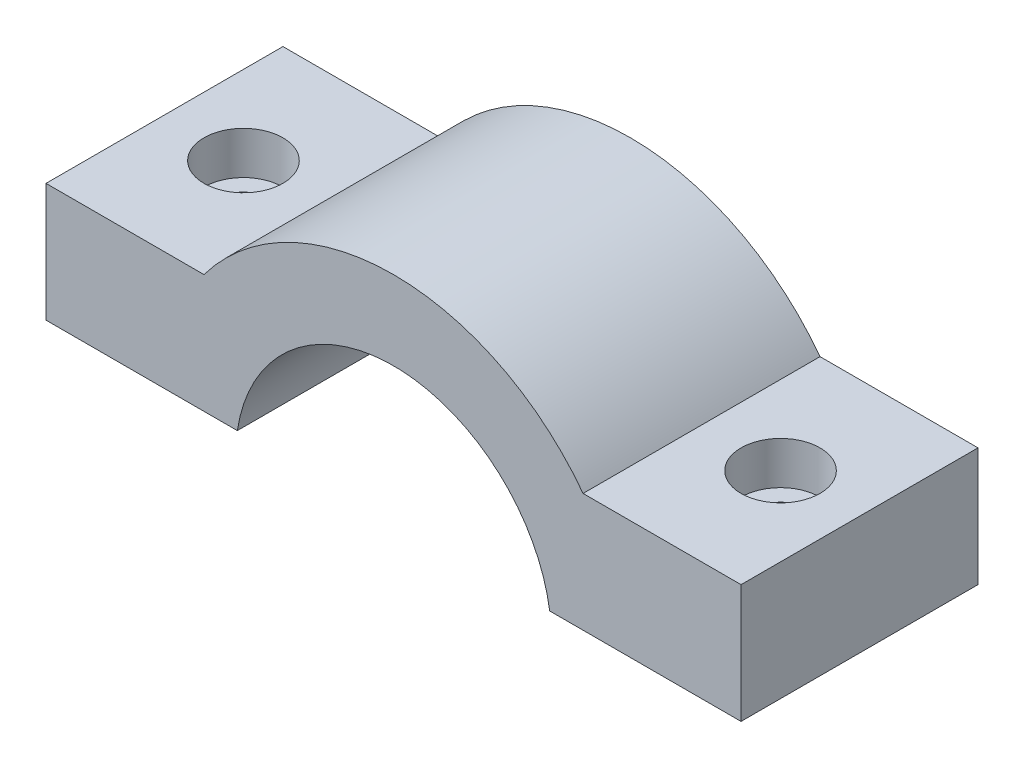
ISO-10303-21;
HEADER;
FILE_DESCRIPTION(('STEP AP214'),'2;1');
FILE_NAME('part.step','',(''),(''),'','','');
FILE_SCHEMA(('AUTOMOTIVE_DESIGN { 1 0 10303 214 1 1 1 1 }'));
ENDSEC;
DATA;
#1=APPLICATION_CONTEXT('core data for automotive mechanical design processes');
#2=APPLICATION_PROTOCOL_DEFINITION('international standard','automotive_design',2000,#1);
#3=PRODUCT_CONTEXT('',#1,'mechanical');
#4=PRODUCT('Part','Part','',(#3));
#5=PRODUCT_RELATED_PRODUCT_CATEGORY('part','',(#4));
#6=PRODUCT_DEFINITION_FORMATION('','',#4);
#7=PRODUCT_DEFINITION_CONTEXT('part definition',#1,'design');
#8=PRODUCT_DEFINITION('design','',#6,#7);
#9=PRODUCT_DEFINITION_SHAPE('','',#8);
#10=(LENGTH_UNIT() NAMED_UNIT(*) SI_UNIT(.MILLI.,.METRE.));
#11=(NAMED_UNIT(*) PLANE_ANGLE_UNIT() SI_UNIT($,.RADIAN.));
#12=(NAMED_UNIT(*) SI_UNIT($,.STERADIAN.) SOLID_ANGLE_UNIT());
#13=UNCERTAINTY_MEASURE_WITH_UNIT(LENGTH_MEASURE(1.E-05),#10,'distance_accuracy_value','');
#14=(GEOMETRIC_REPRESENTATION_CONTEXT(3) GLOBAL_UNCERTAINTY_ASSIGNED_CONTEXT((#13)) GLOBAL_UNIT_ASSIGNED_CONTEXT((#10,
#11,#12)) REPRESENTATION_CONTEXT('',''));
#15=CARTESIAN_POINT('',(0.,0.,0.));
#16=DIRECTION('',(0.,0.,1.));
#17=DIRECTION('',(1.,0.,0.));
#18=AXIS2_PLACEMENT_3D('',#15,#16,#17);
#19=CARTESIAN_POINT('',(43.3831093124538,13.9292003817143,15.));
#20=DIRECTION('',(0.,1.,0.));
#21=DIRECTION('',(0.,0.,1.));
#22=AXIS2_PLACEMENT_3D('',#19,#20,#21);
#23=PLANE('',#22);
#24=CARTESIAN_POINT('',(53.3831093124538,13.9292003817143,0.));
#25=DIRECTION('',(0.,1.,0.));
#26=DIRECTION('',(0.,0.,1.));
#27=AXIS2_PLACEMENT_3D('',#24,#25,#26);
#28=CIRCLE('',#27,5.);
#29=CARTESIAN_POINT('',(53.3831093124538,13.9292003817143,5.));
#30=VERTEX_POINT('',#29);
#31=EDGE_CURVE('E228',#30,#30,#28,.T.);
#32=ORIENTED_EDGE('',*,*,#31,.F.);
#33=EDGE_LOOP('',(#32));
#34=FACE_BOUND('',#33,.T.);
#35=DIRECTION('',(1.,0.,0.));
#36=VECTOR('',#35,1.);
#37=CARTESIAN_POINT('',(43.3831093124538,13.9292003817143,-15.));
#38=LINE('',#37,#36);
#39=CARTESIAN_POINT('',(43.3831093124538,13.9292003817143,-15.));
#40=VERTEX_POINT('',#39);
#41=CARTESIAN_POINT('',(63.3831093124538,13.9292003817143,-15.));
#42=VERTEX_POINT('',#41);
#43=EDGE_CURVE('E129',#40,#42,#38,.T.);
#44=ORIENTED_EDGE('',*,*,#43,.F.);
#45=DIRECTION('',(0.,0.,-1.));
#46=VECTOR('',#45,1.);
#47=CARTESIAN_POINT('',(43.3831093124538,13.9292003817143,15.));
#48=LINE('',#47,#46);
#49=CARTESIAN_POINT('',(43.3831093124538,13.9292003817143,15.));
#50=VERTEX_POINT('',#49);
#51=EDGE_CURVE('E11',#50,#40,#48,.T.);
#52=ORIENTED_EDGE('',*,*,#51,.F.);
#53=DIRECTION('',(1.,0.,0.));
#54=VECTOR('',#53,1.);
#55=CARTESIAN_POINT('',(43.3831093124538,13.9292003817143,15.));
#56=LINE('',#55,#54);
#57=CARTESIAN_POINT('',(63.3831093124538,13.9292003817143,15.));
#58=VERTEX_POINT('',#57);
#59=EDGE_CURVE('E148',#50,#58,#56,.T.);
#60=ORIENTED_EDGE('',*,*,#59,.T.);
#61=DIRECTION('',(0.,0.,-1.));
#62=VECTOR('',#61,1.);
#63=CARTESIAN_POINT('',(63.3831093124538,13.9292003817143,15.));
#64=LINE('',#63,#62);
#65=EDGE_CURVE('E36',#58,#42,#64,.T.);
#66=ORIENTED_EDGE('',*,*,#65,.T.);
#67=EDGE_LOOP('',(#44,#52,#60,#66));
#68=FACE_BOUND('',#67,.T.);
#69=ADVANCED_FACE('F33',(#34,#68),#23,.T.);
#70=CARTESIAN_POINT('',(43.3831093124538,-1.07079961828569,15.));
#71=DIRECTION('',(-1.,0.,0.));
#72=DIRECTION('',(0.,0.,1.));
#73=AXIS2_PLACEMENT_3D('',#70,#71,#72);
#74=PLANE('',#73);
#75=DIRECTION('',(0.,1.,0.));
#76=VECTOR('',#75,1.);
#77=CARTESIAN_POINT('',(43.3831093124538,-1.07079961828569,-15.));
#78=LINE('',#77,#76);
#79=CARTESIAN_POINT('',(43.3831093124538,-1.07079961828569,-15.));
#80=VERTEX_POINT('',#79);
#81=EDGE_CURVE('E146',#80,#40,#78,.T.);
#82=ORIENTED_EDGE('',*,*,#81,.F.);
#83=DIRECTION('',(0.,0.,-1.));
#84=VECTOR('',#83,1.);
#85=CARTESIAN_POINT('',(43.3831093124538,-1.07079961828569,15.));
#86=LINE('',#85,#84);
#87=CARTESIAN_POINT('',(43.3831093124538,-1.07079961828569,15.));
#88=VERTEX_POINT('',#87);
#89=EDGE_CURVE('E42',#88,#80,#86,.T.);
#90=ORIENTED_EDGE('',*,*,#89,.F.);
#91=DIRECTION('',(0.,1.,0.));
#92=VECTOR('',#91,1.);
#93=CARTESIAN_POINT('',(43.3831093124538,-1.07079961828569,15.));
#94=LINE('',#93,#92);
#95=EDGE_CURVE('E109',#88,#50,#94,.T.);
#96=ORIENTED_EDGE('',*,*,#95,.T.);
#97=ORIENTED_EDGE('',*,*,#51,.T.);
#98=EDGE_LOOP('',(#82,#90,#96,#97));
#99=FACE_BOUND('',#98,.T.);
#100=ADVANCED_FACE('F163',(#99),#74,.T.);
#101=CARTESIAN_POINT('',(43.3831093124538,-1.07079961828569,15.));
#102=DIRECTION('',(0.,1.,0.));
#103=DIRECTION('',(0.,0.,1.));
#104=AXIS2_PLACEMENT_3D('',#101,#102,#103);
#105=PLANE('',#104);
#106=CARTESIAN_POINT('',(53.3831093124538,-1.07079961828569,0.));
#107=DIRECTION('',(0.,1.,0.));
#108=DIRECTION('',(0.,0.,1.));
#109=AXIS2_PLACEMENT_3D('',#106,#107,#108);
#110=CIRCLE('',#109,2.75);
#111=CARTESIAN_POINT('',(53.3831093124538,-1.07079961828569,2.75));
#112=VERTEX_POINT('',#111);
#113=EDGE_CURVE('E235',#112,#112,#110,.T.);
#114=ORIENTED_EDGE('',*,*,#113,.T.);
#115=EDGE_LOOP('',(#114));
#116=FACE_BOUND('',#115,.T.);
#117=DIRECTION('',(1.,0.,0.));
#118=VECTOR('',#117,1.);
#119=CARTESIAN_POINT('',(43.3831093124538,-1.07079961828569,-15.));
#120=LINE('',#119,#118);
#121=CARTESIAN_POINT('',(67.6093893791686,-1.07079961828569,-15.));
#122=VERTEX_POINT('',#121);
#123=EDGE_CURVE('E114',#80,#122,#120,.T.);
#124=ORIENTED_EDGE('',*,*,#123,.T.);
#125=DIRECTION('',(0.,0.,-1.));
#126=VECTOR('',#125,1.);
#127=CARTESIAN_POINT('',(67.6093893791686,-1.07079961828569,15.));
#128=LINE('',#127,#126);
#129=CARTESIAN_POINT('',(67.6093893791686,-1.07079961828569,15.));
#130=VERTEX_POINT('',#129);
#131=EDGE_CURVE('E112',#130,#122,#128,.T.);
#132=ORIENTED_EDGE('',*,*,#131,.F.);
#133=DIRECTION('',(1.,0.,0.));
#134=VECTOR('',#133,1.);
#135=CARTESIAN_POINT('',(43.3831093124538,-1.07079961828569,15.));
#136=LINE('',#135,#134);
#137=EDGE_CURVE('E103',#88,#130,#136,.T.);
#138=ORIENTED_EDGE('',*,*,#137,.F.);
#139=ORIENTED_EDGE('',*,*,#89,.T.);
#140=EDGE_LOOP('',(#124,#132,#138,#139));
#141=FACE_BOUND('',#140,.T.);
#142=ADVANCED_FACE('F113',(#116,#141),#105,.F.);
#143=CARTESIAN_POINT('',(87.3831093124538,-4.07079961828569,15.));
#144=DIRECTION('',(0.,0.,-1.));
#145=DIRECTION('',(-1.,0.,0.));
#146=AXIS2_PLACEMENT_3D('',#143,#144,#145);
#147=CYLINDRICAL_SURFACE('',#146,20.);
#148=CARTESIAN_POINT('',(87.3831093124538,-4.07079961828569,-15.));
#149=DIRECTION('',(0.,0.,-1.));
#150=DIRECTION('',(-1.,0.,0.));
#151=AXIS2_PLACEMENT_3D('',#148,#149,#150);
#152=CIRCLE('',#151,20.);
#153=CARTESIAN_POINT('',(107.156829245739,-1.07079961828569,-15.));
#154=VERTEX_POINT('',#153);
#155=EDGE_CURVE('E143',#122,#154,#152,.T.);
#156=ORIENTED_EDGE('',*,*,#155,.T.);
#157=DIRECTION('',(0.,0.,-1.));
#158=VECTOR('',#157,1.);
#159=CARTESIAN_POINT('',(107.156829245739,-1.07079961828569,15.));
#160=LINE('',#159,#158);
#161=CARTESIAN_POINT('',(107.156829245739,-1.07079961828569,15.));
#162=VERTEX_POINT('',#161);
#163=EDGE_CURVE('E117',#162,#154,#160,.T.);
#164=ORIENTED_EDGE('',*,*,#163,.F.);
#165=CARTESIAN_POINT('',(87.3831093124538,-4.07079961828569,15.));
#166=DIRECTION('',(0.,0.,-1.));
#167=DIRECTION('',(-1.,0.,0.));
#168=AXIS2_PLACEMENT_3D('',#165,#166,#167);
#169=CIRCLE('',#168,20.);
#170=EDGE_CURVE('E107',#130,#162,#169,.T.);
#171=ORIENTED_EDGE('',*,*,#170,.F.);
#172=ORIENTED_EDGE('',*,*,#131,.T.);
#173=EDGE_LOOP('',(#156,#164,#171,#172));
#174=FACE_BOUND('',#173,.T.);
#175=ADVANCED_FACE('F119',(#174),#147,.F.);
#176=CARTESIAN_POINT('',(107.156829245739,-1.07079961828569,15.));
#177=DIRECTION('',(0.,1.,0.));
#178=DIRECTION('',(0.,0.,1.));
#179=AXIS2_PLACEMENT_3D('',#176,#177,#178);
#180=PLANE('',#179);
#181=CARTESIAN_POINT('',(121.383109312454,-1.07079961828569,0.));
#182=DIRECTION('',(0.,1.,0.));
#183=DIRECTION('',(0.,0.,1.));
#184=AXIS2_PLACEMENT_3D('',#181,#182,#183);
#185=CIRCLE('',#184,2.75);
#186=CARTESIAN_POINT('',(121.383109312454,-1.07079961828569,2.74999999999998));
#187=VERTEX_POINT('',#186);
#188=EDGE_CURVE('E133',#187,#187,#185,.T.);
#189=ORIENTED_EDGE('',*,*,#188,.T.);
#190=EDGE_LOOP('',(#189));
#191=FACE_BOUND('',#190,.T.);
#192=DIRECTION('',(1.,0.,0.));
#193=VECTOR('',#192,1.);
#194=CARTESIAN_POINT('',(107.156829245739,-1.07079961828569,-15.));
#195=LINE('',#194,#193);
#196=CARTESIAN_POINT('',(131.383109312454,-1.07079961828569,-15.));
#197=VERTEX_POINT('',#196);
#198=EDGE_CURVE('E141',#154,#197,#195,.T.);
#199=ORIENTED_EDGE('',*,*,#198,.T.);
#200=DIRECTION('',(0.,0.,-1.));
#201=VECTOR('',#200,1.);
#202=CARTESIAN_POINT('',(131.383109312454,-1.07079961828569,15.));
#203=LINE('',#202,#201);
#204=CARTESIAN_POINT('',(131.383109312454,-1.07079961828569,15.));
#205=VERTEX_POINT('',#204);
#206=EDGE_CURVE('E152',#205,#197,#203,.T.);
#207=ORIENTED_EDGE('',*,*,#206,.F.);
#208=DIRECTION('',(1.,0.,0.));
#209=VECTOR('',#208,1.);
#210=CARTESIAN_POINT('',(107.156829245739,-1.07079961828569,15.));
#211=LINE('',#210,#209);
#212=EDGE_CURVE('E122',#162,#205,#211,.T.);
#213=ORIENTED_EDGE('',*,*,#212,.F.);
#214=ORIENTED_EDGE('',*,*,#163,.T.);
#215=EDGE_LOOP('',(#199,#207,#213,#214));
#216=FACE_BOUND('',#215,.T.);
#217=ADVANCED_FACE('F178',(#191,#216),#180,.F.);
#218=CARTESIAN_POINT('',(131.383109312454,-1.07079961828569,15.));
#219=DIRECTION('',(-1.,0.,0.));
#220=DIRECTION('',(0.,0.,1.));
#221=AXIS2_PLACEMENT_3D('',#218,#219,#220);
#222=PLANE('',#221);
#223=DIRECTION('',(0.,1.,0.));
#224=VECTOR('',#223,1.);
#225=CARTESIAN_POINT('',(131.383109312454,-1.07079961828569,-15.));
#226=LINE('',#225,#224);
#227=CARTESIAN_POINT('',(131.383109312454,13.9292003817143,-15.));
#228=VERTEX_POINT('',#227);
#229=EDGE_CURVE('E139',#197,#228,#226,.T.);
#230=ORIENTED_EDGE('',*,*,#229,.T.);
#231=DIRECTION('',(0.,0.,-1.));
#232=VECTOR('',#231,1.);
#233=CARTESIAN_POINT('',(131.383109312454,13.9292003817143,15.));
#234=LINE('',#233,#232);
#235=CARTESIAN_POINT('',(131.383109312454,13.9292003817143,15.));
#236=VERTEX_POINT('',#235);
#237=EDGE_CURVE('E155',#236,#228,#234,.T.);
#238=ORIENTED_EDGE('',*,*,#237,.F.);
#239=DIRECTION('',(0.,1.,0.));
#240=VECTOR('',#239,1.);
#241=CARTESIAN_POINT('',(131.383109312454,-1.07079961828569,15.));
#242=LINE('',#241,#240);
#243=EDGE_CURVE('E124',#205,#236,#242,.T.);
#244=ORIENTED_EDGE('',*,*,#243,.F.);
#245=ORIENTED_EDGE('',*,*,#206,.T.);
#246=EDGE_LOOP('',(#230,#238,#244,#245));
#247=FACE_BOUND('',#246,.T.);
#248=ADVANCED_FACE('F181',(#247),#222,.F.);
#249=CARTESIAN_POINT('',(131.383109312454,13.9292003817143,15.));
#250=DIRECTION('',(0.,-1.,0.));
#251=DIRECTION('',(1.,0.,0.));
#252=AXIS2_PLACEMENT_3D('',#249,#250,#251);
#253=PLANE('',#252);
#254=CARTESIAN_POINT('',(121.383109312454,13.9292003817143,0.));
#255=DIRECTION('',(0.,1.,0.));
#256=DIRECTION('',(0.,0.,1.));
#257=AXIS2_PLACEMENT_3D('',#254,#255,#256);
#258=CIRCLE('',#257,4.99999999999999);
#259=CARTESIAN_POINT('',(121.383109312454,13.9292003817143,4.99999999999997));
#260=VERTEX_POINT('',#259);
#261=EDGE_CURVE('E238',#260,#260,#258,.T.);
#262=ORIENTED_EDGE('',*,*,#261,.F.);
#263=EDGE_LOOP('',(#262));
#264=FACE_BOUND('',#263,.T.);
#265=DIRECTION('',(-1.,0.,0.));
#266=VECTOR('',#265,1.);
#267=CARTESIAN_POINT('',(131.383109312454,13.9292003817143,-15.));
#268=LINE('',#267,#266);
#269=CARTESIAN_POINT('',(111.383109312454,13.9292003817143,-15.));
#270=VERTEX_POINT('',#269);
#271=EDGE_CURVE('E136',#228,#270,#268,.T.);
#272=ORIENTED_EDGE('',*,*,#271,.T.);
#273=DIRECTION('',(0.,0.,-1.));
#274=VECTOR('',#273,1.);
#275=CARTESIAN_POINT('',(111.383109312454,13.9292003817143,15.));
#276=LINE('',#275,#274);
#277=CARTESIAN_POINT('',(111.383109312454,13.9292003817143,15.));
#278=VERTEX_POINT('',#277);
#279=EDGE_CURVE('E157',#278,#270,#276,.T.);
#280=ORIENTED_EDGE('',*,*,#279,.F.);
#281=DIRECTION('',(-1.,0.,0.));
#282=VECTOR('',#281,1.);
#283=CARTESIAN_POINT('',(131.383109312454,13.9292003817143,15.));
#284=LINE('',#283,#282);
#285=EDGE_CURVE('E252',#236,#278,#284,.T.);
#286=ORIENTED_EDGE('',*,*,#285,.F.);
#287=ORIENTED_EDGE('',*,*,#237,.T.);
#288=EDGE_LOOP('',(#272,#280,#286,#287));
#289=FACE_BOUND('',#288,.T.);
#290=ADVANCED_FACE('F185',(#264,#289),#253,.F.);
#291=CARTESIAN_POINT('',(87.3831093124538,-4.07079961828569,15.));
#292=DIRECTION('',(0.,0.,-1.));
#293=DIRECTION('',(-1.,0.,0.));
#294=AXIS2_PLACEMENT_3D('',#291,#292,#293);
#295=CYLINDRICAL_SURFACE('',#294,30.);
#296=CARTESIAN_POINT('',(87.3831093124538,-4.07079961828569,-15.));
#297=DIRECTION('',(0.,0.,-1.));
#298=DIRECTION('',(-1.,0.,0.));
#299=AXIS2_PLACEMENT_3D('',#296,#297,#298);
#300=CIRCLE('',#299,30.);
#301=EDGE_CURVE('E132',#42,#270,#300,.T.);
#302=ORIENTED_EDGE('',*,*,#301,.F.);
#303=ORIENTED_EDGE('',*,*,#65,.F.);
#304=CARTESIAN_POINT('',(87.3831093124538,-4.07079961828569,15.));
#305=DIRECTION('',(0.,0.,-1.));
#306=DIRECTION('',(-1.,0.,0.));
#307=AXIS2_PLACEMENT_3D('',#304,#305,#306);
#308=CIRCLE('',#307,30.);
#309=EDGE_CURVE('E250',#58,#278,#308,.T.);
#310=ORIENTED_EDGE('',*,*,#309,.T.);
#311=ORIENTED_EDGE('',*,*,#279,.T.);
#312=EDGE_LOOP('',(#302,#303,#310,#311));
#313=FACE_BOUND('',#312,.T.);
#314=ADVANCED_FACE('F159',(#313),#295,.T.);
#315=CARTESIAN_POINT('',(87.3831093124538,-4.07079961828569,15.));
#316=DIRECTION('',(0.,0.,-1.));
#317=DIRECTION('',(-1.,0.,0.));
#318=AXIS2_PLACEMENT_3D('',#315,#316,#317);
#319=PLANE('',#318);
#320=ORIENTED_EDGE('',*,*,#59,.F.);
#321=ORIENTED_EDGE('',*,*,#95,.F.);
#322=ORIENTED_EDGE('',*,*,#137,.T.);
#323=ORIENTED_EDGE('',*,*,#170,.T.);
#324=ORIENTED_EDGE('',*,*,#212,.T.);
#325=ORIENTED_EDGE('',*,*,#243,.T.);
#326=ORIENTED_EDGE('',*,*,#285,.T.);
#327=ORIENTED_EDGE('',*,*,#309,.F.);
#328=EDGE_LOOP('',(#320,#321,#322,#323,#324,#325,#326,#327));
#329=FACE_BOUND('',#328,.T.);
#330=ADVANCED_FACE('F105',(#329),#319,.F.);
#331=CARTESIAN_POINT('',(87.3831093124538,-4.07079961828569,-15.));
#332=DIRECTION('',(0.,0.,-1.));
#333=DIRECTION('',(-1.,0.,0.));
#334=AXIS2_PLACEMENT_3D('',#331,#332,#333);
#335=PLANE('',#334);
#336=ORIENTED_EDGE('',*,*,#43,.T.);
#337=ORIENTED_EDGE('',*,*,#301,.T.);
#338=ORIENTED_EDGE('',*,*,#271,.F.);
#339=ORIENTED_EDGE('',*,*,#229,.F.);
#340=ORIENTED_EDGE('',*,*,#198,.F.);
#341=ORIENTED_EDGE('',*,*,#155,.F.);
#342=ORIENTED_EDGE('',*,*,#123,.F.);
#343=ORIENTED_EDGE('',*,*,#81,.T.);
#344=EDGE_LOOP('',(#336,#337,#338,#339,#340,#341,#342,#343));
#345=FACE_BOUND('',#344,.T.);
#346=ADVANCED_FACE('F162',(#345),#335,.T.);
#347=CARTESIAN_POINT('',(121.383109312454,13.9292003817143,0.));
#348=DIRECTION('',(0.,1.,0.));
#349=DIRECTION('',(0.,0.,1.));
#350=AXIS2_PLACEMENT_3D('',#347,#348,#349);
#351=CYLINDRICAL_SURFACE('',#350,2.75);
#352=ORIENTED_EDGE('',*,*,#188,.F.);
#353=EDGE_LOOP('',(#352));
#354=FACE_BOUND('',#353,.T.);
#355=CARTESIAN_POINT('',(121.383109312454,8.5292003817143,0.));
#356=DIRECTION('',(0.,1.,0.));
#357=DIRECTION('',(0.,0.,1.));
#358=AXIS2_PLACEMENT_3D('',#355,#356,#357);
#359=CIRCLE('',#358,2.75);
#360=CARTESIAN_POINT('',(121.383109312454,8.5292003817143,2.74999999999998));
#361=VERTEX_POINT('',#360);
#362=EDGE_CURVE('E244',#361,#361,#359,.T.);
#363=ORIENTED_EDGE('',*,*,#362,.T.);
#364=EDGE_LOOP('',(#363));
#365=FACE_BOUND('',#364,.T.);
#366=ADVANCED_FACE('F196',(#354,#365),#351,.F.);
#367=CARTESIAN_POINT('',(124.133109312454,8.5292003817143,0.));
#368=DIRECTION('',(0.,-1.,0.));
#369=DIRECTION('',(0.,0.,-1.));
#370=AXIS2_PLACEMENT_3D('',#367,#368,#369);
#371=PLANE('',#370);
#372=ORIENTED_EDGE('',*,*,#362,.F.);
#373=EDGE_LOOP('',(#372));
#374=FACE_BOUND('',#373,.T.);
#375=CARTESIAN_POINT('',(121.383109312454,8.5292003817143,0.));
#376=DIRECTION('',(0.,1.,0.));
#377=DIRECTION('',(0.,0.,1.));
#378=AXIS2_PLACEMENT_3D('',#375,#376,#377);
#379=CIRCLE('',#378,4.99999999999999);
#380=CARTESIAN_POINT('',(121.383109312454,8.5292003817143,4.99999999999997));
#381=VERTEX_POINT('',#380);
#382=EDGE_CURVE('E241',#381,#381,#379,.T.);
#383=ORIENTED_EDGE('',*,*,#382,.T.);
#384=EDGE_LOOP('',(#383));
#385=FACE_BOUND('',#384,.T.);
#386=ADVANCED_FACE('F200',(#374,#385),#371,.F.);
#387=CARTESIAN_POINT('',(121.383109312454,13.9292003817143,0.));
#388=DIRECTION('',(0.,1.,0.));
#389=DIRECTION('',(0.,0.,1.));
#390=AXIS2_PLACEMENT_3D('',#387,#388,#389);
#391=CYLINDRICAL_SURFACE('',#390,4.99999999999999);
#392=ORIENTED_EDGE('',*,*,#382,.F.);
#393=EDGE_LOOP('',(#392));
#394=FACE_BOUND('',#393,.T.);
#395=ORIENTED_EDGE('',*,*,#261,.T.);
#396=EDGE_LOOP('',(#395));
#397=FACE_BOUND('',#396,.T.);
#398=ADVANCED_FACE('F204',(#394,#397),#391,.F.);
#399=CARTESIAN_POINT('',(53.3831093124538,13.9292003817143,0.));
#400=DIRECTION('',(0.,1.,0.));
#401=DIRECTION('',(0.,0.,1.));
#402=AXIS2_PLACEMENT_3D('',#399,#400,#401);
#403=CYLINDRICAL_SURFACE('',#402,2.75);
#404=ORIENTED_EDGE('',*,*,#113,.F.);
#405=EDGE_LOOP('',(#404));
#406=FACE_BOUND('',#405,.T.);
#407=CARTESIAN_POINT('',(53.3831093124538,8.52920038171431,0.));
#408=DIRECTION('',(0.,1.,0.));
#409=DIRECTION('',(0.,0.,1.));
#410=AXIS2_PLACEMENT_3D('',#407,#408,#409);
#411=CIRCLE('',#410,2.75);
#412=CARTESIAN_POINT('',(53.3831093124538,8.52920038171431,2.75000000000001));
#413=VERTEX_POINT('',#412);
#414=EDGE_CURVE('E230',#413,#413,#411,.T.);
#415=ORIENTED_EDGE('',*,*,#414,.T.);
#416=EDGE_LOOP('',(#415));
#417=FACE_BOUND('',#416,.T.);
#418=ADVANCED_FACE('F208',(#406,#417),#403,.F.);
#419=CARTESIAN_POINT('',(56.1331093124538,8.52920038171431,0.));
#420=DIRECTION('',(0.,-1.,0.));
#421=DIRECTION('',(0.,0.,-1.));
#422=AXIS2_PLACEMENT_3D('',#419,#420,#421);
#423=PLANE('',#422);
#424=ORIENTED_EDGE('',*,*,#414,.F.);
#425=EDGE_LOOP('',(#424));
#426=FACE_BOUND('',#425,.T.);
#427=CARTESIAN_POINT('',(53.3831093124538,8.52920038171431,0.));
#428=DIRECTION('',(0.,1.,0.));
#429=DIRECTION('',(0.,0.,1.));
#430=AXIS2_PLACEMENT_3D('',#427,#428,#429);
#431=CIRCLE('',#430,5.);
#432=CARTESIAN_POINT('',(53.3831093124538,8.52920038171431,5.));
#433=VERTEX_POINT('',#432);
#434=EDGE_CURVE('E225',#433,#433,#431,.T.);
#435=ORIENTED_EDGE('',*,*,#434,.T.);
#436=EDGE_LOOP('',(#435));
#437=FACE_BOUND('',#436,.T.);
#438=ADVANCED_FACE('F212',(#426,#437),#423,.F.);
#439=CARTESIAN_POINT('',(53.3831093124538,13.9292003817143,0.));
#440=DIRECTION('',(0.,1.,0.));
#441=DIRECTION('',(0.,0.,1.));
#442=AXIS2_PLACEMENT_3D('',#439,#440,#441);
#443=CYLINDRICAL_SURFACE('',#442,5.);
#444=ORIENTED_EDGE('',*,*,#434,.F.);
#445=EDGE_LOOP('',(#444));
#446=FACE_BOUND('',#445,.T.);
#447=ORIENTED_EDGE('',*,*,#31,.T.);
#448=EDGE_LOOP('',(#447));
#449=FACE_BOUND('',#448,.T.);
#450=ADVANCED_FACE('F216',(#446,#449),#443,.F.);
#451=CLOSED_SHELL('',(#69,#100,#142,#175,#217,#248,#290,#314,#330,#346,#366,#386,#398,#418,#438,#450));
#452=MANIFOLD_SOLID_BREP('B2',#451);
#453=ADVANCED_BREP_SHAPE_REPRESENTATION('',(#18,#452),#14);
#454=SHAPE_DEFINITION_REPRESENTATION(#9,#453);
ENDSEC;
END-ISO-10303-21;
